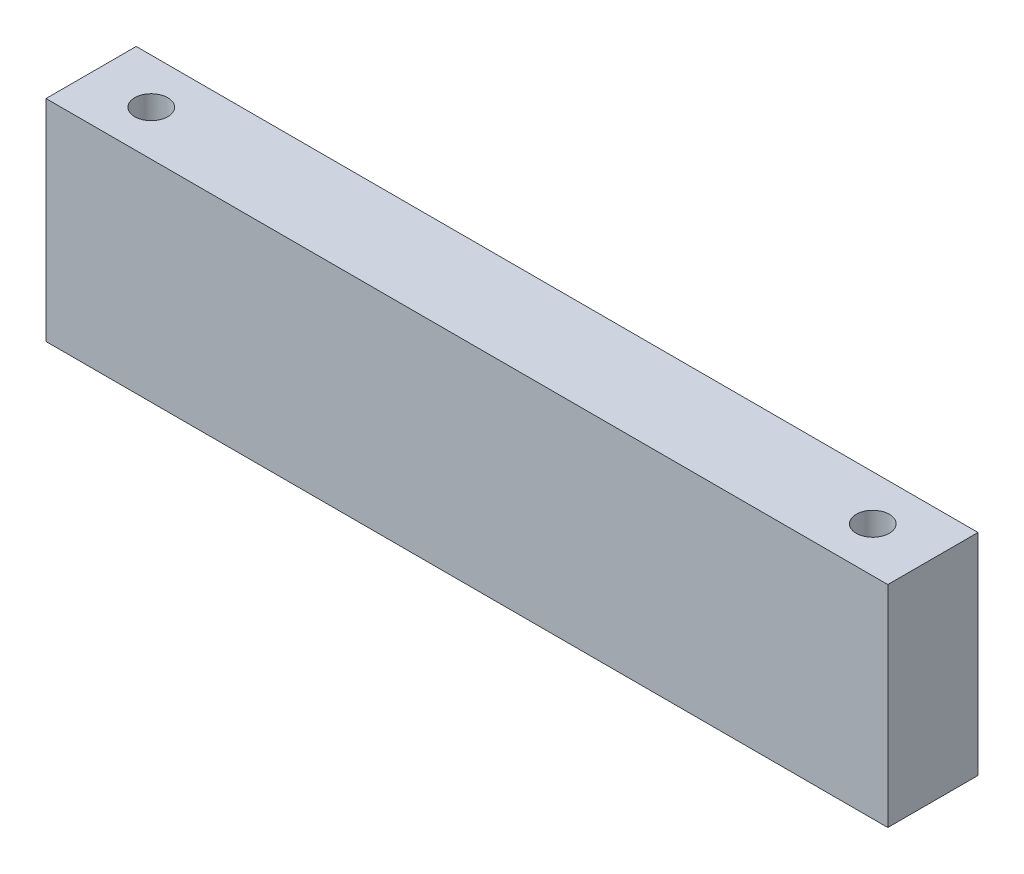
ISO-10303-21;
HEADER;
FILE_DESCRIPTION(('STEP AP214'),'2;1');
FILE_NAME('part.step','',(''),(''),'','','');
FILE_SCHEMA(('AUTOMOTIVE_DESIGN { 1 0 10303 214 1 1 1 1 }'));
ENDSEC;
DATA;
#1=APPLICATION_CONTEXT('core data for automotive mechanical design processes');
#2=APPLICATION_PROTOCOL_DEFINITION('international standard','automotive_design',2000,#1);
#3=PRODUCT_CONTEXT('',#1,'mechanical');
#4=PRODUCT('Part','Part','',(#3));
#5=PRODUCT_RELATED_PRODUCT_CATEGORY('part','',(#4));
#6=PRODUCT_DEFINITION_FORMATION('','',#4);
#7=PRODUCT_DEFINITION_CONTEXT('part definition',#1,'design');
#8=PRODUCT_DEFINITION('design','',#6,#7);
#9=PRODUCT_DEFINITION_SHAPE('','',#8);
#10=(LENGTH_UNIT() NAMED_UNIT(*) SI_UNIT(.MILLI.,.METRE.));
#11=(NAMED_UNIT(*) PLANE_ANGLE_UNIT() SI_UNIT($,.RADIAN.));
#12=(NAMED_UNIT(*) SI_UNIT($,.STERADIAN.) SOLID_ANGLE_UNIT());
#13=UNCERTAINTY_MEASURE_WITH_UNIT(LENGTH_MEASURE(1.E-05),#10,'distance_accuracy_value','');
#14=(GEOMETRIC_REPRESENTATION_CONTEXT(3) GLOBAL_UNCERTAINTY_ASSIGNED_CONTEXT((#13)) GLOBAL_UNIT_ASSIGNED_CONTEXT((#10,
#11,#12)) REPRESENTATION_CONTEXT('',''));
#15=CARTESIAN_POINT('',(0.,0.,0.));
#16=DIRECTION('',(0.,0.,1.));
#17=DIRECTION('',(1.,0.,0.));
#18=AXIS2_PLACEMENT_3D('',#15,#16,#17);
#19=CARTESIAN_POINT('',(140.,-35.,30.));
#20=DIRECTION('',(-1.,0.,0.));
#21=DIRECTION('',(0.,0.,1.));
#22=AXIS2_PLACEMENT_3D('',#19,#20,#21);
#23=PLANE('',#22);
#24=DIRECTION('',(0.,1.,0.));
#25=VECTOR('',#24,1.);
#26=CARTESIAN_POINT('',(140.,-35.,0.));
#27=LINE('',#26,#25);
#28=CARTESIAN_POINT('',(140.,-35.,0.));
#29=VERTEX_POINT('',#28);
#30=CARTESIAN_POINT('',(140.,35.,0.));
#31=VERTEX_POINT('',#30);
#32=EDGE_CURVE('E99',#29,#31,#27,.T.);
#33=ORIENTED_EDGE('',*,*,#32,.T.);
#34=DIRECTION('',(0.,0.,-1.));
#35=VECTOR('',#34,1.);
#36=CARTESIAN_POINT('',(140.,35.,30.));
#37=LINE('',#36,#35);
#38=CARTESIAN_POINT('',(140.,35.,30.));
#39=VERTEX_POINT('',#38);
#40=EDGE_CURVE('E11',#39,#31,#37,.T.);
#41=ORIENTED_EDGE('',*,*,#40,.F.);
#42=DIRECTION('',(0.,1.,0.));
#43=VECTOR('',#42,1.);
#44=CARTESIAN_POINT('',(140.,-35.,30.));
#45=LINE('',#44,#43);
#46=CARTESIAN_POINT('',(140.,-35.,30.));
#47=VERTEX_POINT('',#46);
#48=EDGE_CURVE('E86',#47,#39,#45,.T.);
#49=ORIENTED_EDGE('',*,*,#48,.F.);
#50=DIRECTION('',(0.,0.,-1.));
#51=VECTOR('',#50,1.);
#52=CARTESIAN_POINT('',(140.,-35.,30.));
#53=LINE('',#52,#51);
#54=EDGE_CURVE('E95',#47,#29,#53,.T.);
#55=ORIENTED_EDGE('',*,*,#54,.T.);
#56=EDGE_LOOP('',(#33,#41,#49,#55));
#57=FACE_BOUND('',#56,.T.);
#58=ADVANCED_FACE('F33',(#57),#23,.F.);
#59=CARTESIAN_POINT('',(-140.,35.,30.));
#60=DIRECTION('',(0.,-1.,0.));
#61=DIRECTION('',(0.,0.,-1.));
#62=AXIS2_PLACEMENT_3D('',#59,#60,#61);
#63=PLANE('',#62);
#64=CARTESIAN_POINT('',(-120.,35.,15.));
#65=DIRECTION('',(0.,1.,0.));
#66=DIRECTION('',(0.,0.,1.));
#67=AXIS2_PLACEMENT_3D('',#64,#65,#66);
#68=CIRCLE('',#67,5.49999999999999);
#69=CARTESIAN_POINT('',(-120.,35.,20.5));
#70=VERTEX_POINT('',#69);
#71=EDGE_CURVE('E108',#70,#70,#68,.T.);
#72=ORIENTED_EDGE('',*,*,#71,.F.);
#73=EDGE_LOOP('',(#72));
#74=FACE_BOUND('',#73,.T.);
#75=CARTESIAN_POINT('',(120.,35.,15.));
#76=DIRECTION('',(0.,1.,0.));
#77=DIRECTION('',(0.,0.,1.));
#78=AXIS2_PLACEMENT_3D('',#75,#76,#77);
#79=CIRCLE('',#78,5.49999999999999);
#80=CARTESIAN_POINT('',(120.,35.,20.5));
#81=VERTEX_POINT('',#80);
#82=EDGE_CURVE('E113',#81,#81,#79,.T.);
#83=ORIENTED_EDGE('',*,*,#82,.F.);
#84=EDGE_LOOP('',(#83));
#85=FACE_BOUND('',#84,.T.);
#86=DIRECTION('',(-1.,0.,0.));
#87=VECTOR('',#86,1.);
#88=CARTESIAN_POINT('',(-140.,35.,0.));
#89=LINE('',#88,#87);
#90=CARTESIAN_POINT('',(-140.,35.,0.));
#91=VERTEX_POINT('',#90);
#92=EDGE_CURVE('E90',#31,#91,#89,.T.);
#93=ORIENTED_EDGE('',*,*,#92,.T.);
#94=DIRECTION('',(0.,0.,-1.));
#95=VECTOR('',#94,1.);
#96=CARTESIAN_POINT('',(-140.,35.,30.));
#97=LINE('',#96,#95);
#98=CARTESIAN_POINT('',(-140.,35.,30.));
#99=VERTEX_POINT('',#98);
#100=EDGE_CURVE('E42',#99,#91,#97,.T.);
#101=ORIENTED_EDGE('',*,*,#100,.F.);
#102=DIRECTION('',(-1.,0.,0.));
#103=VECTOR('',#102,1.);
#104=CARTESIAN_POINT('',(-140.,35.,30.));
#105=LINE('',#104,#103);
#106=EDGE_CURVE('E81',#39,#99,#105,.T.);
#107=ORIENTED_EDGE('',*,*,#106,.F.);
#108=ORIENTED_EDGE('',*,*,#40,.T.);
#109=EDGE_LOOP('',(#93,#101,#107,#108));
#110=FACE_BOUND('',#109,.T.);
#111=ADVANCED_FACE('F89',(#74,#85,#110),#63,.F.);
#112=CARTESIAN_POINT('',(-140.,-35.,30.));
#113=DIRECTION('',(1.,0.,0.));
#114=DIRECTION('',(0.,0.,-1.));
#115=AXIS2_PLACEMENT_3D('',#112,#113,#114);
#116=PLANE('',#115);
#117=DIRECTION('',(0.,-1.,0.));
#118=VECTOR('',#117,1.);
#119=CARTESIAN_POINT('',(-140.,-35.,0.));
#120=LINE('',#119,#118);
#121=CARTESIAN_POINT('',(-140.,-35.,0.));
#122=VERTEX_POINT('',#121);
#123=EDGE_CURVE('E68',#91,#122,#120,.T.);
#124=ORIENTED_EDGE('',*,*,#123,.T.);
#125=DIRECTION('',(0.,0.,-1.));
#126=VECTOR('',#125,1.);
#127=CARTESIAN_POINT('',(-140.,-35.,30.));
#128=LINE('',#127,#126);
#129=CARTESIAN_POINT('',(-140.,-35.,30.));
#130=VERTEX_POINT('',#129);
#131=EDGE_CURVE('E91',#130,#122,#128,.T.);
#132=ORIENTED_EDGE('',*,*,#131,.F.);
#133=DIRECTION('',(0.,-1.,0.));
#134=VECTOR('',#133,1.);
#135=CARTESIAN_POINT('',(-140.,-35.,30.));
#136=LINE('',#135,#134);
#137=EDGE_CURVE('E84',#99,#130,#136,.T.);
#138=ORIENTED_EDGE('',*,*,#137,.F.);
#139=ORIENTED_EDGE('',*,*,#100,.T.);
#140=EDGE_LOOP('',(#124,#132,#138,#139));
#141=FACE_BOUND('',#140,.T.);
#142=ADVANCED_FACE('F93',(#141),#116,.F.);
#143=CARTESIAN_POINT('',(-140.,-35.,30.));
#144=DIRECTION('',(0.,1.,0.));
#145=DIRECTION('',(-1.,0.,0.));
#146=AXIS2_PLACEMENT_3D('',#143,#144,#145);
#147=PLANE('',#146);
#148=CARTESIAN_POINT('',(-120.,-35.,15.));
#149=DIRECTION('',(0.,1.,0.));
#150=DIRECTION('',(-1.,0.,0.));
#151=AXIS2_PLACEMENT_3D('',#148,#149,#150);
#152=CIRCLE('',#151,5.49999999999999);
#153=CARTESIAN_POINT('',(-125.5,-35.,15.));
#154=VERTEX_POINT('',#153);
#155=EDGE_CURVE('E36',#154,#154,#152,.T.);
#156=ORIENTED_EDGE('',*,*,#155,.T.);
#157=EDGE_LOOP('',(#156));
#158=FACE_BOUND('',#157,.T.);
#159=CARTESIAN_POINT('',(120.,-35.,15.));
#160=DIRECTION('',(0.,1.,0.));
#161=DIRECTION('',(-1.,0.,0.));
#162=AXIS2_PLACEMENT_3D('',#159,#160,#161);
#163=CIRCLE('',#162,5.49999999999999);
#164=CARTESIAN_POINT('',(114.5,-35.,15.));
#165=VERTEX_POINT('',#164);
#166=EDGE_CURVE('E106',#165,#165,#163,.T.);
#167=ORIENTED_EDGE('',*,*,#166,.T.);
#168=EDGE_LOOP('',(#167));
#169=FACE_BOUND('',#168,.T.);
#170=DIRECTION('',(1.,0.,0.));
#171=VECTOR('',#170,1.);
#172=CARTESIAN_POINT('',(-140.,-35.,0.));
#173=LINE('',#172,#171);
#174=EDGE_CURVE('E74',#122,#29,#173,.T.);
#175=ORIENTED_EDGE('',*,*,#174,.T.);
#176=ORIENTED_EDGE('',*,*,#54,.F.);
#177=DIRECTION('',(1.,0.,0.));
#178=VECTOR('',#177,1.);
#179=CARTESIAN_POINT('',(-140.,-35.,30.));
#180=LINE('',#179,#178);
#181=EDGE_CURVE('E51',#130,#47,#180,.T.);
#182=ORIENTED_EDGE('',*,*,#181,.F.);
#183=ORIENTED_EDGE('',*,*,#131,.T.);
#184=EDGE_LOOP('',(#175,#176,#182,#183));
#185=FACE_BOUND('',#184,.T.);
#186=ADVANCED_FACE('F130',(#158,#169,#185),#147,.F.);
#187=CARTESIAN_POINT('',(0.,0.,30.));
#188=DIRECTION('',(0.,0.,-1.));
#189=DIRECTION('',(-1.,0.,0.));
#190=AXIS2_PLACEMENT_3D('',#187,#188,#189);
#191=PLANE('',#190);
#192=ORIENTED_EDGE('',*,*,#48,.T.);
#193=ORIENTED_EDGE('',*,*,#106,.T.);
#194=ORIENTED_EDGE('',*,*,#137,.T.);
#195=ORIENTED_EDGE('',*,*,#181,.T.);
#196=EDGE_LOOP('',(#192,#193,#194,#195));
#197=FACE_BOUND('',#196,.T.);
#198=ADVANCED_FACE('F82',(#197),#191,.F.);
#199=CARTESIAN_POINT('',(0.,0.,0.));
#200=DIRECTION('',(0.,0.,-1.));
#201=DIRECTION('',(-1.,0.,0.));
#202=AXIS2_PLACEMENT_3D('',#199,#200,#201);
#203=PLANE('',#202);
#204=ORIENTED_EDGE('',*,*,#32,.F.);
#205=ORIENTED_EDGE('',*,*,#174,.F.);
#206=ORIENTED_EDGE('',*,*,#123,.F.);
#207=ORIENTED_EDGE('',*,*,#92,.F.);
#208=EDGE_LOOP('',(#204,#205,#206,#207));
#209=FACE_BOUND('',#208,.T.);
#210=ADVANCED_FACE('F137',(#209),#203,.T.);
#211=CARTESIAN_POINT('',(120.,-45.,15.));
#212=DIRECTION('',(0.,1.,0.));
#213=DIRECTION('',(0.,0.,1.));
#214=AXIS2_PLACEMENT_3D('',#211,#212,#213);
#215=CYLINDRICAL_SURFACE('',#214,5.49999999999999);
#216=ORIENTED_EDGE('',*,*,#82,.T.);
#217=EDGE_LOOP('',(#216));
#218=FACE_BOUND('',#217,.T.);
#219=ORIENTED_EDGE('',*,*,#166,.F.);
#220=EDGE_LOOP('',(#219));
#221=FACE_BOUND('',#220,.T.);
#222=ADVANCED_FACE('F121',(#218,#221),#215,.F.);
#223=CARTESIAN_POINT('',(-120.,-45.,15.));
#224=DIRECTION('',(0.,1.,0.));
#225=DIRECTION('',(0.,0.,1.));
#226=AXIS2_PLACEMENT_3D('',#223,#224,#225);
#227=CYLINDRICAL_SURFACE('',#226,5.49999999999999);
#228=ORIENTED_EDGE('',*,*,#71,.T.);
#229=EDGE_LOOP('',(#228));
#230=FACE_BOUND('',#229,.T.);
#231=ORIENTED_EDGE('',*,*,#155,.F.);
#232=EDGE_LOOP('',(#231));
#233=FACE_BOUND('',#232,.T.);
#234=ADVANCED_FACE('F145',(#230,#233),#227,.F.);
#235=CLOSED_SHELL('',(#58,#111,#142,#186,#198,#210,#222,#234));
#236=MANIFOLD_SOLID_BREP('B2',#235);
#237=ADVANCED_BREP_SHAPE_REPRESENTATION('',(#18,#236),#14);
#238=SHAPE_DEFINITION_REPRESENTATION(#9,#237);
ENDSEC;
END-ISO-10303-21;
